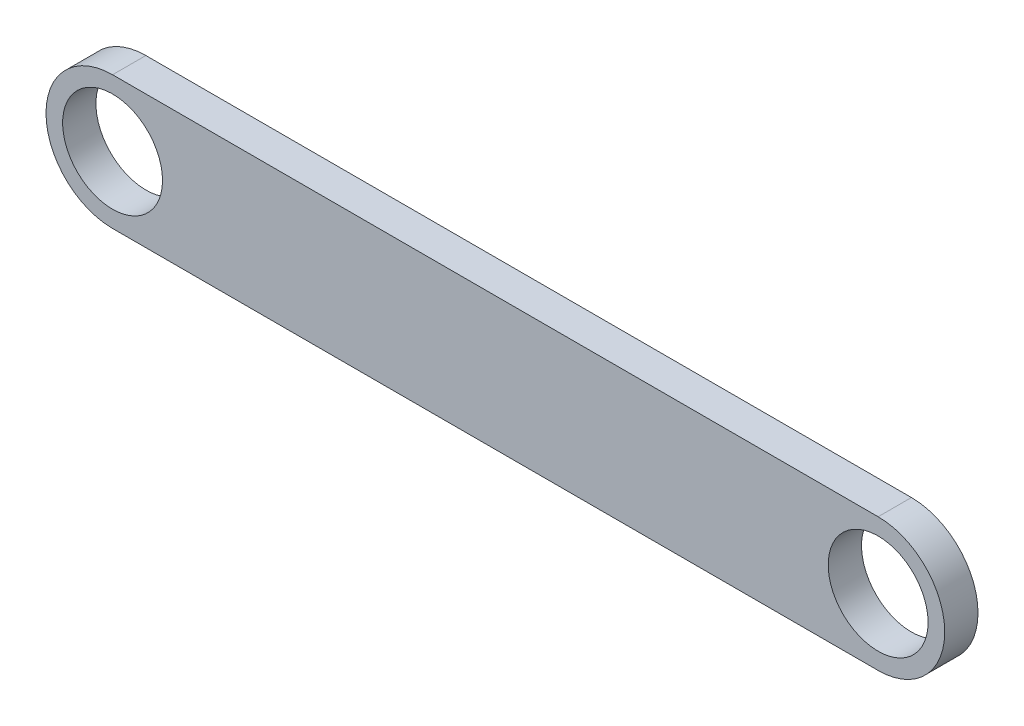
ISO-10303-21;
HEADER;
FILE_DESCRIPTION(('STEP AP214'),'2;1');
FILE_NAME('part.step','',(''),(''),'','','');
FILE_SCHEMA(('AUTOMOTIVE_DESIGN { 1 0 10303 214 1 1 1 1 }'));
ENDSEC;
DATA;
#1=APPLICATION_CONTEXT('core data for automotive mechanical design processes');
#2=APPLICATION_PROTOCOL_DEFINITION('international standard','automotive_design',2000,#1);
#3=PRODUCT_CONTEXT('',#1,'mechanical');
#4=PRODUCT('Part','Part','',(#3));
#5=PRODUCT_RELATED_PRODUCT_CATEGORY('part','',(#4));
#6=PRODUCT_DEFINITION_FORMATION('','',#4);
#7=PRODUCT_DEFINITION_CONTEXT('part definition',#1,'design');
#8=PRODUCT_DEFINITION('design','',#6,#7);
#9=PRODUCT_DEFINITION_SHAPE('','',#8);
#10=(LENGTH_UNIT() NAMED_UNIT(*) SI_UNIT(.MILLI.,.METRE.));
#11=(NAMED_UNIT(*) PLANE_ANGLE_UNIT() SI_UNIT($,.RADIAN.));
#12=(NAMED_UNIT(*) SI_UNIT($,.STERADIAN.) SOLID_ANGLE_UNIT());
#13=UNCERTAINTY_MEASURE_WITH_UNIT(LENGTH_MEASURE(1.E-05),#10,'distance_accuracy_value','');
#14=(GEOMETRIC_REPRESENTATION_CONTEXT(3) GLOBAL_UNCERTAINTY_ASSIGNED_CONTEXT((#13)) GLOBAL_UNIT_ASSIGNED_CONTEXT((#10,
#11,#12)) REPRESENTATION_CONTEXT('',''));
#15=CARTESIAN_POINT('',(0.,0.,0.));
#16=DIRECTION('',(0.,0.,1.));
#17=DIRECTION('',(1.,0.,0.));
#18=AXIS2_PLACEMENT_3D('',#15,#16,#17);
#19=CARTESIAN_POINT('',(0.,0.,10.));
#20=DIRECTION('',(0.,0.,1.));
#21=DIRECTION('',(1.,0.,0.));
#22=AXIS2_PLACEMENT_3D('',#19,#20,#21);
#23=PLANE('',#22);
#24=CARTESIAN_POINT('',(0.,0.,10.));
#25=DIRECTION('',(0.,0.,1.));
#26=DIRECTION('',(1.,0.,0.));
#27=AXIS2_PLACEMENT_3D('',#24,#25,#26);
#28=CIRCLE('',#27,15.);
#29=CARTESIAN_POINT('',(15.,0.,10.));
#30=VERTEX_POINT('',#29);
#31=EDGE_CURVE('E106',#30,#30,#28,.T.);
#32=ORIENTED_EDGE('',*,*,#31,.F.);
#33=EDGE_LOOP('',(#32));
#34=FACE_BOUND('',#33,.T.);
#35=CARTESIAN_POINT('',(0.,0.,10.));
#36=DIRECTION('',(0.,0.,1.));
#37=DIRECTION('',(1.,0.,0.));
#38=AXIS2_PLACEMENT_3D('',#35,#36,#37);
#39=CIRCLE('',#38,20.);
#40=CARTESIAN_POINT('',(0.,20.,10.));
#41=VERTEX_POINT('',#40);
#42=CARTESIAN_POINT('',(0.,-20.,10.));
#43=VERTEX_POINT('',#42);
#44=EDGE_CURVE('E91',#41,#43,#39,.T.);
#45=ORIENTED_EDGE('',*,*,#44,.T.);
#46=DIRECTION('',(1.,0.,0.));
#47=VECTOR('',#46,1.);
#48=CARTESIAN_POINT('',(0.,-20.,10.));
#49=LINE('',#48,#47);
#50=CARTESIAN_POINT('',(230.,-20.,10.));
#51=VERTEX_POINT('',#50);
#52=EDGE_CURVE('E86',#43,#51,#49,.T.);
#53=ORIENTED_EDGE('',*,*,#52,.T.);
#54=CARTESIAN_POINT('',(230.,0.,10.));
#55=DIRECTION('',(0.,0.,1.));
#56=DIRECTION('',(1.,0.,0.));
#57=AXIS2_PLACEMENT_3D('',#54,#55,#56);
#58=CIRCLE('',#57,20.);
#59=CARTESIAN_POINT('',(230.,20.,10.));
#60=VERTEX_POINT('',#59);
#61=EDGE_CURVE('E89',#51,#60,#58,.T.);
#62=ORIENTED_EDGE('',*,*,#61,.T.);
#63=DIRECTION('',(-1.,0.,0.));
#64=VECTOR('',#63,1.);
#65=CARTESIAN_POINT('',(0.,20.,10.));
#66=LINE('',#65,#64);
#67=EDGE_CURVE('E56',#60,#41,#66,.T.);
#68=ORIENTED_EDGE('',*,*,#67,.T.);
#69=EDGE_LOOP('',(#45,#53,#62,#68));
#70=FACE_BOUND('',#69,.T.);
#71=CARTESIAN_POINT('',(230.,0.,10.));
#72=DIRECTION('',(0.,0.,1.));
#73=DIRECTION('',(1.,0.,0.));
#74=AXIS2_PLACEMENT_3D('',#71,#72,#73);
#75=CIRCLE('',#74,15.);
#76=CARTESIAN_POINT('',(245.,0.,10.));
#77=VERTEX_POINT('',#76);
#78=EDGE_CURVE('E121',#77,#77,#75,.T.);
#79=ORIENTED_EDGE('',*,*,#78,.F.);
#80=EDGE_LOOP('',(#79));
#81=FACE_BOUND('',#80,.T.);
#82=ADVANCED_FACE('F39',(#34,#70,#81),#23,.T.);
#83=CARTESIAN_POINT('',(0.,0.,0.));
#84=DIRECTION('',(0.,0.,1.));
#85=DIRECTION('',(1.,0.,0.));
#86=AXIS2_PLACEMENT_3D('',#83,#84,#85);
#87=PLANE('',#86);
#88=CARTESIAN_POINT('',(0.,0.,0.));
#89=DIRECTION('',(0.,0.,1.));
#90=DIRECTION('',(1.,0.,0.));
#91=AXIS2_PLACEMENT_3D('',#88,#89,#90);
#92=CIRCLE('',#91,20.);
#93=CARTESIAN_POINT('',(0.,20.,0.));
#94=VERTEX_POINT('',#93);
#95=CARTESIAN_POINT('',(0.,-20.,0.));
#96=VERTEX_POINT('',#95);
#97=EDGE_CURVE('E103',#94,#96,#92,.T.);
#98=ORIENTED_EDGE('',*,*,#97,.F.);
#99=DIRECTION('',(-1.,0.,0.));
#100=VECTOR('',#99,1.);
#101=CARTESIAN_POINT('',(0.,20.,0.));
#102=LINE('',#101,#100);
#103=CARTESIAN_POINT('',(230.,20.,0.));
#104=VERTEX_POINT('',#103);
#105=EDGE_CURVE('E79',#104,#94,#102,.T.);
#106=ORIENTED_EDGE('',*,*,#105,.F.);
#107=CARTESIAN_POINT('',(230.,0.,0.));
#108=DIRECTION('',(0.,0.,1.));
#109=DIRECTION('',(1.,0.,0.));
#110=AXIS2_PLACEMENT_3D('',#107,#108,#109);
#111=CIRCLE('',#110,20.);
#112=CARTESIAN_POINT('',(230.,-20.,0.));
#113=VERTEX_POINT('',#112);
#114=EDGE_CURVE('E73',#113,#104,#111,.T.);
#115=ORIENTED_EDGE('',*,*,#114,.F.);
#116=DIRECTION('',(1.,0.,0.));
#117=VECTOR('',#116,1.);
#118=CARTESIAN_POINT('',(0.,-20.,0.));
#119=LINE('',#118,#117);
#120=EDGE_CURVE('E95',#96,#113,#119,.T.);
#121=ORIENTED_EDGE('',*,*,#120,.F.);
#122=EDGE_LOOP('',(#98,#106,#115,#121));
#123=FACE_BOUND('',#122,.T.);
#124=CARTESIAN_POINT('',(0.,0.,0.));
#125=DIRECTION('',(0.,0.,1.));
#126=DIRECTION('',(1.,0.,0.));
#127=AXIS2_PLACEMENT_3D('',#124,#125,#126);
#128=CIRCLE('',#127,15.);
#129=CARTESIAN_POINT('',(15.,0.,0.));
#130=VERTEX_POINT('',#129);
#131=EDGE_CURVE('E118',#130,#130,#128,.T.);
#132=ORIENTED_EDGE('',*,*,#131,.T.);
#133=EDGE_LOOP('',(#132));
#134=FACE_BOUND('',#133,.T.);
#135=CARTESIAN_POINT('',(230.,0.,0.));
#136=DIRECTION('',(0.,0.,1.));
#137=DIRECTION('',(1.,0.,0.));
#138=AXIS2_PLACEMENT_3D('',#135,#136,#137);
#139=CIRCLE('',#138,15.);
#140=CARTESIAN_POINT('',(245.,0.,0.));
#141=VERTEX_POINT('',#140);
#142=EDGE_CURVE('E124',#141,#141,#139,.T.);
#143=ORIENTED_EDGE('',*,*,#142,.T.);
#144=EDGE_LOOP('',(#143));
#145=FACE_BOUND('',#144,.T.);
#146=ADVANCED_FACE('F114',(#123,#134,#145),#87,.F.);
#147=CARTESIAN_POINT('',(0.,0.,10.));
#148=DIRECTION('',(0.,0.,-1.));
#149=DIRECTION('',(-1.,0.,0.));
#150=AXIS2_PLACEMENT_3D('',#147,#148,#149);
#151=CYLINDRICAL_SURFACE('',#150,20.);
#152=ORIENTED_EDGE('',*,*,#97,.T.);
#153=DIRECTION('',(0.,0.,-1.));
#154=VECTOR('',#153,1.);
#155=CARTESIAN_POINT('',(0.,-20.,10.));
#156=LINE('',#155,#154);
#157=EDGE_CURVE('E11',#43,#96,#156,.T.);
#158=ORIENTED_EDGE('',*,*,#157,.F.);
#159=ORIENTED_EDGE('',*,*,#44,.F.);
#160=DIRECTION('',(0.,0.,-1.));
#161=VECTOR('',#160,1.);
#162=CARTESIAN_POINT('',(0.,20.,10.));
#163=LINE('',#162,#161);
#164=EDGE_CURVE('E99',#41,#94,#163,.T.);
#165=ORIENTED_EDGE('',*,*,#164,.T.);
#166=EDGE_LOOP('',(#152,#158,#159,#165));
#167=FACE_BOUND('',#166,.T.);
#168=ADVANCED_FACE('F41',(#167),#151,.T.);
#169=CARTESIAN_POINT('',(0.,-20.,10.));
#170=DIRECTION('',(0.,1.,0.));
#171=DIRECTION('',(-1.,0.,0.));
#172=AXIS2_PLACEMENT_3D('',#169,#170,#171);
#173=PLANE('',#172);
#174=ORIENTED_EDGE('',*,*,#120,.T.);
#175=DIRECTION('',(0.,0.,-1.));
#176=VECTOR('',#175,1.);
#177=CARTESIAN_POINT('',(230.,-20.,10.));
#178=LINE('',#177,#176);
#179=EDGE_CURVE('E48',#51,#113,#178,.T.);
#180=ORIENTED_EDGE('',*,*,#179,.F.);
#181=ORIENTED_EDGE('',*,*,#52,.F.);
#182=ORIENTED_EDGE('',*,*,#157,.T.);
#183=EDGE_LOOP('',(#174,#180,#181,#182));
#184=FACE_BOUND('',#183,.T.);
#185=ADVANCED_FACE('F94',(#184),#173,.F.);
#186=CARTESIAN_POINT('',(230.,0.,10.));
#187=DIRECTION('',(0.,0.,-1.));
#188=DIRECTION('',(-1.,0.,0.));
#189=AXIS2_PLACEMENT_3D('',#186,#187,#188);
#190=CYLINDRICAL_SURFACE('',#189,20.);
#191=ORIENTED_EDGE('',*,*,#114,.T.);
#192=DIRECTION('',(0.,0.,-1.));
#193=VECTOR('',#192,1.);
#194=CARTESIAN_POINT('',(230.,20.,10.));
#195=LINE('',#194,#193);
#196=EDGE_CURVE('E96',#60,#104,#195,.T.);
#197=ORIENTED_EDGE('',*,*,#196,.F.);
#198=ORIENTED_EDGE('',*,*,#61,.F.);
#199=ORIENTED_EDGE('',*,*,#179,.T.);
#200=EDGE_LOOP('',(#191,#197,#198,#199));
#201=FACE_BOUND('',#200,.T.);
#202=ADVANCED_FACE('F97',(#201),#190,.T.);
#203=CARTESIAN_POINT('',(0.,20.,10.));
#204=DIRECTION('',(0.,-1.,0.));
#205=DIRECTION('',(1.,0.,0.));
#206=AXIS2_PLACEMENT_3D('',#203,#204,#205);
#207=PLANE('',#206);
#208=ORIENTED_EDGE('',*,*,#105,.T.);
#209=ORIENTED_EDGE('',*,*,#164,.F.);
#210=ORIENTED_EDGE('',*,*,#67,.F.);
#211=ORIENTED_EDGE('',*,*,#196,.T.);
#212=EDGE_LOOP('',(#208,#209,#210,#211));
#213=FACE_BOUND('',#212,.T.);
#214=ADVANCED_FACE('F111',(#213),#207,.F.);
#215=CARTESIAN_POINT('',(0.,0.,10.));
#216=DIRECTION('',(0.,0.,-1.));
#217=DIRECTION('',(-1.,0.,0.));
#218=AXIS2_PLACEMENT_3D('',#215,#216,#217);
#219=CYLINDRICAL_SURFACE('',#218,15.);
#220=ORIENTED_EDGE('',*,*,#31,.T.);
#221=EDGE_LOOP('',(#220));
#222=FACE_BOUND('',#221,.T.);
#223=ORIENTED_EDGE('',*,*,#131,.F.);
#224=EDGE_LOOP('',(#223));
#225=FACE_BOUND('',#224,.T.);
#226=ADVANCED_FACE('F141',(#222,#225),#219,.F.);
#227=CARTESIAN_POINT('',(230.,0.,10.));
#228=DIRECTION('',(0.,0.,-1.));
#229=DIRECTION('',(-1.,0.,0.));
#230=AXIS2_PLACEMENT_3D('',#227,#228,#229);
#231=CYLINDRICAL_SURFACE('',#230,15.);
#232=ORIENTED_EDGE('',*,*,#78,.T.);
#233=EDGE_LOOP('',(#232));
#234=FACE_BOUND('',#233,.T.);
#235=ORIENTED_EDGE('',*,*,#142,.F.);
#236=EDGE_LOOP('',(#235));
#237=FACE_BOUND('',#236,.T.);
#238=ADVANCED_FACE('F130',(#234,#237),#231,.F.);
#239=CLOSED_SHELL('',(#82,#146,#168,#185,#202,#214,#226,#238));
#240=MANIFOLD_SOLID_BREP('B2',#239);
#241=ADVANCED_BREP_SHAPE_REPRESENTATION('',(#18,#240),#14);
#242=SHAPE_DEFINITION_REPRESENTATION(#9,#241);
ENDSEC;
END-ISO-10303-21;
